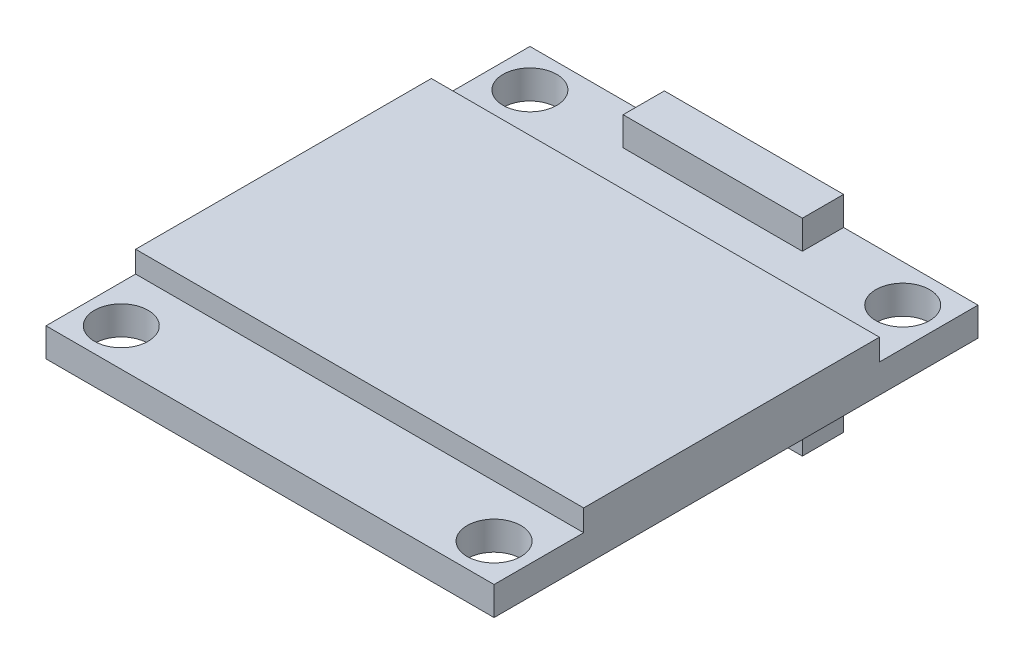
ISO-10303-21;
HEADER;
FILE_DESCRIPTION(('STEP AP214'),'2;1');
FILE_NAME('part.step','',(''),(''),'','','');
FILE_SCHEMA(('AUTOMOTIVE_DESIGN { 1 0 10303 214 1 1 1 1 }'));
ENDSEC;
DATA;
#1=APPLICATION_CONTEXT('core data for automotive mechanical design processes');
#2=APPLICATION_PROTOCOL_DEFINITION('international standard','automotive_design',2000,#1);
#3=PRODUCT_CONTEXT('',#1,'mechanical');
#4=PRODUCT('Part','Part','',(#3));
#5=PRODUCT_RELATED_PRODUCT_CATEGORY('part','',(#4));
#6=PRODUCT_DEFINITION_FORMATION('','',#4);
#7=PRODUCT_DEFINITION_CONTEXT('part definition',#1,'design');
#8=PRODUCT_DEFINITION('design','',#6,#7);
#9=PRODUCT_DEFINITION_SHAPE('','',#8);
#10=(LENGTH_UNIT() NAMED_UNIT(*) SI_UNIT(.MILLI.,.METRE.));
#11=(NAMED_UNIT(*) PLANE_ANGLE_UNIT() SI_UNIT($,.RADIAN.));
#12=(NAMED_UNIT(*) SI_UNIT($,.STERADIAN.) SOLID_ANGLE_UNIT());
#13=UNCERTAINTY_MEASURE_WITH_UNIT(LENGTH_MEASURE(1.E-05),#10,'distance_accuracy_value','');
#14=(GEOMETRIC_REPRESENTATION_CONTEXT(3) GLOBAL_UNCERTAINTY_ASSIGNED_CONTEXT((#13)) GLOBAL_UNIT_ASSIGNED_CONTEXT((#10,
#11,#12)) REPRESENTATION_CONTEXT('',''));
#15=CARTESIAN_POINT('',(0.,0.,0.));
#16=DIRECTION('',(0.,0.,1.));
#17=DIRECTION('',(1.,0.,0.));
#18=AXIS2_PLACEMENT_3D('',#15,#16,#17);
#19=CARTESIAN_POINT('',(0.,1.6,0.));
#20=DIRECTION('',(0.,-1.,0.));
#21=DIRECTION('',(0.,0.,-1.));
#22=AXIS2_PLACEMENT_3D('',#19,#20,#21);
#23=PLANE('',#22);
#24=CARTESIAN_POINT('',(22.9,1.6,-24.9));
#25=DIRECTION('',(0.,1.,0.));
#26=DIRECTION('',(0.,0.,-1.));
#27=AXIS2_PLACEMENT_3D('',#24,#25,#26);
#28=CIRCLE('',#27,1.5);
#29=CARTESIAN_POINT('',(22.9,1.6,-26.4));
#30=VERTEX_POINT('',#29);
#31=EDGE_CURVE('E230',#30,#30,#28,.T.);
#32=ORIENTED_EDGE('',*,*,#31,.F.);
#33=EDGE_LOOP('',(#32));
#34=FACE_BOUND('',#33,.T.);
#35=CARTESIAN_POINT('',(2.1,1.6,-24.9));
#36=DIRECTION('',(0.,1.,0.));
#37=DIRECTION('',(0.,0.,1.));
#38=AXIS2_PLACEMENT_3D('',#35,#36,#37);
#39=CIRCLE('',#38,1.5);
#40=CARTESIAN_POINT('',(2.1,1.6,-23.4));
#41=VERTEX_POINT('',#40);
#42=EDGE_CURVE('E229',#41,#41,#39,.T.);
#43=ORIENTED_EDGE('',*,*,#42,.F.);
#44=EDGE_LOOP('',(#43));
#45=FACE_BOUND('',#44,.T.);
#46=DIRECTION('',(-1.,0.,0.));
#47=VECTOR('',#46,1.);
#48=CARTESIAN_POINT('',(0.,1.6,-27.));
#49=LINE('',#48,#47);
#50=CARTESIAN_POINT('',(25.,1.6,-27.));
#51=VERTEX_POINT('',#50);
#52=CARTESIAN_POINT('',(17.5,1.6,-27.));
#53=VERTEX_POINT('',#52);
#54=EDGE_CURVE('E306',#51,#53,#49,.T.);
#55=ORIENTED_EDGE('',*,*,#54,.T.);
#56=DIRECTION('',(0.,0.,1.));
#57=VECTOR('',#56,1.);
#58=CARTESIAN_POINT('',(17.5,1.6,0.));
#59=LINE('',#58,#57);
#60=CARTESIAN_POINT('',(17.5,1.6,-24.7));
#61=VERTEX_POINT('',#60);
#62=EDGE_CURVE('E217',#53,#61,#59,.T.);
#63=ORIENTED_EDGE('',*,*,#62,.T.);
#64=DIRECTION('',(-1.,0.,0.));
#65=VECTOR('',#64,1.);
#66=CARTESIAN_POINT('',(0.,1.6,-24.7));
#67=LINE('',#66,#65);
#68=CARTESIAN_POINT('',(7.5,1.6,-24.7));
#69=VERTEX_POINT('',#68);
#70=EDGE_CURVE('E221',#61,#69,#67,.T.);
#71=ORIENTED_EDGE('',*,*,#70,.T.);
#72=DIRECTION('',(0.,0.,-1.));
#73=VECTOR('',#72,1.);
#74=CARTESIAN_POINT('',(7.5,1.6,0.));
#75=LINE('',#74,#73);
#76=CARTESIAN_POINT('',(7.5,1.6,-27.));
#77=VERTEX_POINT('',#76);
#78=EDGE_CURVE('E156',#69,#77,#75,.T.);
#79=ORIENTED_EDGE('',*,*,#78,.T.);
#80=CARTESIAN_POINT('',(0.,1.6,-27.));
#81=VERTEX_POINT('',#80);
#82=EDGE_CURVE('E305',#77,#81,#49,.T.);
#83=ORIENTED_EDGE('',*,*,#82,.T.);
#84=DIRECTION('',(0.,0.,1.));
#85=VECTOR('',#84,1.);
#86=CARTESIAN_POINT('',(0.,1.6,0.));
#87=LINE('',#86,#85);
#88=CARTESIAN_POINT('',(0.,1.6,-21.5));
#89=VERTEX_POINT('',#88);
#90=EDGE_CURVE('E294',#81,#89,#87,.T.);
#91=ORIENTED_EDGE('',*,*,#90,.T.);
#92=DIRECTION('',(-1.,0.,0.));
#93=VECTOR('',#92,1.);
#94=CARTESIAN_POINT('',(0.,1.6,-21.5));
#95=LINE('',#94,#93);
#96=CARTESIAN_POINT('',(25.,1.6,-21.5));
#97=VERTEX_POINT('',#96);
#98=EDGE_CURVE('E262',#97,#89,#95,.T.);
#99=ORIENTED_EDGE('',*,*,#98,.F.);
#100=DIRECTION('',(0.,0.,-1.));
#101=VECTOR('',#100,1.);
#102=CARTESIAN_POINT('',(25.,1.6,0.));
#103=LINE('',#102,#101);
#104=EDGE_CURVE('E301',#97,#51,#103,.T.);
#105=ORIENTED_EDGE('',*,*,#104,.T.);
#106=EDGE_LOOP('',(#55,#63,#71,#79,#83,#91,#99,#105));
#107=FACE_BOUND('',#106,.T.);
#108=ADVANCED_FACE('F41',(#34,#45,#107),#23,.F.);
#109=CARTESIAN_POINT('',(2.1,1.6,-2.1));
#110=DIRECTION('',(0.,1.,0.));
#111=DIRECTION('',(0.,0.,-1.));
#112=AXIS2_PLACEMENT_3D('',#109,#110,#111);
#113=CIRCLE('',#112,1.5);
#114=CARTESIAN_POINT('',(2.1,1.6,-3.6));
#115=VERTEX_POINT('',#114);
#116=EDGE_CURVE('E224',#115,#115,#113,.T.);
#117=ORIENTED_EDGE('',*,*,#116,.F.);
#118=EDGE_LOOP('',(#117));
#119=FACE_BOUND('',#118,.T.);
#120=CARTESIAN_POINT('',(22.9,1.6,-2.1));
#121=DIRECTION('',(0.,1.,0.));
#122=DIRECTION('',(0.,0.,1.));
#123=AXIS2_PLACEMENT_3D('',#120,#121,#122);
#124=CIRCLE('',#123,1.5);
#125=CARTESIAN_POINT('',(22.9,1.6,-0.599999999999997));
#126=VERTEX_POINT('',#125);
#127=EDGE_CURVE('E238',#126,#126,#124,.T.);
#128=ORIENTED_EDGE('',*,*,#127,.F.);
#129=EDGE_LOOP('',(#128));
#130=FACE_BOUND('',#129,.T.);
#131=DIRECTION('',(1.,0.,0.));
#132=VECTOR('',#131,1.);
#133=CARTESIAN_POINT('',(0.,1.6,-5.));
#134=LINE('',#133,#132);
#135=CARTESIAN_POINT('',(0.,1.6,-5.));
#136=VERTEX_POINT('',#135);
#137=CARTESIAN_POINT('',(25.,1.6,-5.));
#138=VERTEX_POINT('',#137);
#139=EDGE_CURVE('E253',#136,#138,#134,.T.);
#140=ORIENTED_EDGE('',*,*,#139,.F.);
#141=CARTESIAN_POINT('',(0.,1.6,0.));
#142=VERTEX_POINT('',#141);
#143=EDGE_CURVE('E298',#136,#142,#87,.T.);
#144=ORIENTED_EDGE('',*,*,#143,.T.);
#145=DIRECTION('',(1.,0.,0.));
#146=VECTOR('',#145,1.);
#147=CARTESIAN_POINT('',(0.,1.6,0.));
#148=LINE('',#147,#146);
#149=CARTESIAN_POINT('',(25.,1.6,0.));
#150=VERTEX_POINT('',#149);
#151=EDGE_CURVE('E297',#142,#150,#148,.T.);
#152=ORIENTED_EDGE('',*,*,#151,.T.);
#153=EDGE_CURVE('E302',#150,#138,#103,.T.);
#154=ORIENTED_EDGE('',*,*,#153,.T.);
#155=EDGE_LOOP('',(#140,#144,#152,#154));
#156=FACE_BOUND('',#155,.T.);
#157=ADVANCED_FACE('F392',(#119,#130,#156),#23,.F.);
#158=CARTESIAN_POINT('',(0.,1.6,0.));
#159=DIRECTION('',(1.,0.,0.));
#160=DIRECTION('',(0.,0.,-1.));
#161=AXIS2_PLACEMENT_3D('',#158,#159,#160);
#162=PLANE('',#161);
#163=DIRECTION('',(0.,0.,1.));
#164=VECTOR('',#163,1.);
#165=CARTESIAN_POINT('',(0.,0.,0.));
#166=LINE('',#165,#164);
#167=CARTESIAN_POINT('',(0.,0.,-27.));
#168=VERTEX_POINT('',#167);
#169=CARTESIAN_POINT('',(0.,0.,0.));
#170=VERTEX_POINT('',#169);
#171=EDGE_CURVE('E293',#168,#170,#166,.T.);
#172=ORIENTED_EDGE('',*,*,#171,.T.);
#173=DIRECTION('',(0.,-1.,0.));
#174=VECTOR('',#173,1.);
#175=CARTESIAN_POINT('',(0.,1.6,0.));
#176=LINE('',#175,#174);
#177=EDGE_CURVE('E336',#142,#170,#176,.T.);
#178=ORIENTED_EDGE('',*,*,#177,.F.);
#179=ORIENTED_EDGE('',*,*,#143,.F.);
#180=DIRECTION('',(0.,-1.,0.));
#181=VECTOR('',#180,1.);
#182=CARTESIAN_POINT('',(0.,2.8,-5.));
#183=LINE('',#182,#181);
#184=CARTESIAN_POINT('',(0.,2.8,-5.));
#185=VERTEX_POINT('',#184);
#186=EDGE_CURVE('E289',#185,#136,#183,.T.);
#187=ORIENTED_EDGE('',*,*,#186,.F.);
#188=DIRECTION('',(0.,0.,1.));
#189=VECTOR('',#188,1.);
#190=CARTESIAN_POINT('',(0.,2.8,-21.5));
#191=LINE('',#190,#189);
#192=CARTESIAN_POINT('',(0.,2.8,-21.5));
#193=VERTEX_POINT('',#192);
#194=EDGE_CURVE('E257',#193,#185,#191,.T.);
#195=ORIENTED_EDGE('',*,*,#194,.F.);
#196=DIRECTION('',(0.,-1.,0.));
#197=VECTOR('',#196,1.);
#198=CARTESIAN_POINT('',(0.,2.8,-21.5));
#199=LINE('',#198,#197);
#200=EDGE_CURVE('E271',#193,#89,#199,.T.);
#201=ORIENTED_EDGE('',*,*,#200,.T.);
#202=ORIENTED_EDGE('',*,*,#90,.F.);
#203=DIRECTION('',(0.,-1.,0.));
#204=VECTOR('',#203,1.);
#205=CARTESIAN_POINT('',(0.,1.6,-27.));
#206=LINE('',#205,#204);
#207=EDGE_CURVE('E310',#81,#168,#206,.T.);
#208=ORIENTED_EDGE('',*,*,#207,.T.);
#209=EDGE_LOOP('',(#172,#178,#179,#187,#195,#201,#202,#208));
#210=FACE_BOUND('',#209,.T.);
#211=ADVANCED_FACE('F43',(#210),#162,.F.);
#212=CARTESIAN_POINT('',(0.,1.6,0.));
#213=DIRECTION('',(0.,0.,-1.));
#214=DIRECTION('',(-1.,0.,0.));
#215=AXIS2_PLACEMENT_3D('',#212,#213,#214);
#216=PLANE('',#215);
#217=DIRECTION('',(1.,0.,0.));
#218=VECTOR('',#217,1.);
#219=CARTESIAN_POINT('',(0.,0.,0.));
#220=LINE('',#219,#218);
#221=CARTESIAN_POINT('',(25.,0.,0.));
#222=VERTEX_POINT('',#221);
#223=EDGE_CURVE('E314',#170,#222,#220,.T.);
#224=ORIENTED_EDGE('',*,*,#223,.T.);
#225=DIRECTION('',(0.,-1.,0.));
#226=VECTOR('',#225,1.);
#227=CARTESIAN_POINT('',(25.,1.6,0.));
#228=LINE('',#227,#226);
#229=EDGE_CURVE('E332',#150,#222,#228,.T.);
#230=ORIENTED_EDGE('',*,*,#229,.F.);
#231=ORIENTED_EDGE('',*,*,#151,.F.);
#232=ORIENTED_EDGE('',*,*,#177,.T.);
#233=EDGE_LOOP('',(#224,#230,#231,#232));
#234=FACE_BOUND('',#233,.T.);
#235=ADVANCED_FACE('F376',(#234),#216,.F.);
#236=CARTESIAN_POINT('',(25.,1.6,0.));
#237=DIRECTION('',(-1.,0.,0.));
#238=DIRECTION('',(0.,0.,1.));
#239=AXIS2_PLACEMENT_3D('',#236,#237,#238);
#240=PLANE('',#239);
#241=DIRECTION('',(0.,0.,-1.));
#242=VECTOR('',#241,1.);
#243=CARTESIAN_POINT('',(25.,0.,0.));
#244=LINE('',#243,#242);
#245=CARTESIAN_POINT('',(25.,0.,-27.));
#246=VERTEX_POINT('',#245);
#247=EDGE_CURVE('E317',#222,#246,#244,.T.);
#248=ORIENTED_EDGE('',*,*,#247,.T.);
#249=DIRECTION('',(0.,-1.,0.));
#250=VECTOR('',#249,1.);
#251=CARTESIAN_POINT('',(25.,1.6,-27.));
#252=LINE('',#251,#250);
#253=EDGE_CURVE('E328',#51,#246,#252,.T.);
#254=ORIENTED_EDGE('',*,*,#253,.F.);
#255=ORIENTED_EDGE('',*,*,#104,.F.);
#256=DIRECTION('',(0.,-1.,0.));
#257=VECTOR('',#256,1.);
#258=CARTESIAN_POINT('',(25.,2.8,-21.5));
#259=LINE('',#258,#257);
#260=CARTESIAN_POINT('',(25.,2.8,-21.5));
#261=VERTEX_POINT('',#260);
#262=EDGE_CURVE('E281',#261,#97,#259,.T.);
#263=ORIENTED_EDGE('',*,*,#262,.F.);
#264=DIRECTION('',(0.,0.,-1.));
#265=VECTOR('',#264,1.);
#266=CARTESIAN_POINT('',(25.,2.8,-21.5));
#267=LINE('',#266,#265);
#268=CARTESIAN_POINT('',(25.,2.8,-5.));
#269=VERTEX_POINT('',#268);
#270=EDGE_CURVE('E265',#269,#261,#267,.T.);
#271=ORIENTED_EDGE('',*,*,#270,.F.);
#272=DIRECTION('',(0.,-1.,0.));
#273=VECTOR('',#272,1.);
#274=CARTESIAN_POINT('',(25.,2.8,-5.));
#275=LINE('',#274,#273);
#276=EDGE_CURVE('E285',#269,#138,#275,.T.);
#277=ORIENTED_EDGE('',*,*,#276,.T.);
#278=ORIENTED_EDGE('',*,*,#153,.F.);
#279=ORIENTED_EDGE('',*,*,#229,.T.);
#280=EDGE_LOOP('',(#248,#254,#255,#263,#271,#277,#278,#279));
#281=FACE_BOUND('',#280,.T.);
#282=ADVANCED_FACE('F368',(#281),#240,.F.);
#283=CARTESIAN_POINT('',(0.,1.6,-27.));
#284=DIRECTION('',(0.,0.,1.));
#285=DIRECTION('',(1.,0.,0.));
#286=AXIS2_PLACEMENT_3D('',#283,#284,#285);
#287=PLANE('',#286);
#288=ORIENTED_EDGE('',*,*,#82,.F.);
#289=DIRECTION('',(0.,1.,0.));
#290=VECTOR('',#289,1.);
#291=CARTESIAN_POINT('',(7.5,-26.8610915598683,-27.));
#292=LINE('',#291,#290);
#293=CARTESIAN_POINT('',(7.5,3.2,-27.));
#294=VERTEX_POINT('',#293);
#295=EDGE_CURVE('E57',#77,#294,#292,.T.);
#296=ORIENTED_EDGE('',*,*,#295,.T.);
#297=DIRECTION('',(-1.,0.,0.));
#298=VECTOR('',#297,1.);
#299=CARTESIAN_POINT('',(7.5,3.2,-27.));
#300=LINE('',#299,#298);
#301=CARTESIAN_POINT('',(17.5,3.2,-27.));
#302=VERTEX_POINT('',#301);
#303=EDGE_CURVE('E177',#302,#294,#300,.T.);
#304=ORIENTED_EDGE('',*,*,#303,.F.);
#305=DIRECTION('',(0.,1.,0.));
#306=VECTOR('',#305,1.);
#307=CARTESIAN_POINT('',(17.5,-26.8610915598683,-27.));
#308=LINE('',#307,#306);
#309=EDGE_CURVE('E202',#53,#302,#308,.T.);
#310=ORIENTED_EDGE('',*,*,#309,.F.);
#311=ORIENTED_EDGE('',*,*,#54,.F.);
#312=ORIENTED_EDGE('',*,*,#253,.T.);
#313=DIRECTION('',(-1.,0.,0.));
#314=VECTOR('',#313,1.);
#315=CARTESIAN_POINT('',(0.,0.,-27.));
#316=LINE('',#315,#314);
#317=CARTESIAN_POINT('',(17.5,0.,-27.));
#318=VERTEX_POINT('',#317);
#319=EDGE_CURVE('E321',#246,#318,#316,.T.);
#320=ORIENTED_EDGE('',*,*,#319,.T.);
#321=CARTESIAN_POINT('',(17.5,-8.3,-27.));
#322=VERTEX_POINT('',#321);
#323=EDGE_CURVE('E197',#322,#318,#308,.T.);
#324=ORIENTED_EDGE('',*,*,#323,.F.);
#325=DIRECTION('',(-1.,0.,0.));
#326=VECTOR('',#325,1.);
#327=CARTESIAN_POINT('',(7.5,-8.3,-27.));
#328=LINE('',#327,#326);
#329=CARTESIAN_POINT('',(7.5,-8.3,-27.));
#330=VERTEX_POINT('',#329);
#331=EDGE_CURVE('E193',#322,#330,#328,.T.);
#332=ORIENTED_EDGE('',*,*,#331,.T.);
#333=CARTESIAN_POINT('',(7.5,0.,-27.));
#334=VERTEX_POINT('',#333);
#335=EDGE_CURVE('E192',#330,#334,#292,.T.);
#336=ORIENTED_EDGE('',*,*,#335,.T.);
#337=EDGE_CURVE('E320',#334,#168,#316,.T.);
#338=ORIENTED_EDGE('',*,*,#337,.T.);
#339=ORIENTED_EDGE('',*,*,#207,.F.);
#340=EDGE_LOOP('',(#288,#296,#304,#310,#311,#312,#320,#324,#332,#336,#338,#339));
#341=FACE_BOUND('',#340,.T.);
#342=ADVANCED_FACE('F362',(#341),#287,.F.);
#343=CARTESIAN_POINT('',(0.,0.,0.));
#344=DIRECTION('',(0.,-1.,0.));
#345=DIRECTION('',(0.,0.,-1.));
#346=AXIS2_PLACEMENT_3D('',#343,#344,#345);
#347=PLANE('',#346);
#348=DIRECTION('',(0.,0.,1.));
#349=VECTOR('',#348,1.);
#350=CARTESIAN_POINT('',(17.5,0.,0.));
#351=LINE('',#350,#349);
#352=CARTESIAN_POINT('',(17.5,0.,-24.7));
#353=VERTEX_POINT('',#352);
#354=EDGE_CURVE('E12',#318,#353,#351,.T.);
#355=ORIENTED_EDGE('',*,*,#354,.F.);
#356=ORIENTED_EDGE('',*,*,#319,.F.);
#357=ORIENTED_EDGE('',*,*,#247,.F.);
#358=ORIENTED_EDGE('',*,*,#223,.F.);
#359=ORIENTED_EDGE('',*,*,#171,.F.);
#360=ORIENTED_EDGE('',*,*,#337,.F.);
#361=DIRECTION('',(0.,0.,-1.));
#362=VECTOR('',#361,1.);
#363=CARTESIAN_POINT('',(7.5,0.,0.));
#364=LINE('',#363,#362);
#365=CARTESIAN_POINT('',(7.5,0.,-24.7));
#366=VERTEX_POINT('',#365);
#367=EDGE_CURVE('E340',#366,#334,#364,.T.);
#368=ORIENTED_EDGE('',*,*,#367,.F.);
#369=DIRECTION('',(-1.,0.,0.));
#370=VECTOR('',#369,1.);
#371=CARTESIAN_POINT('',(0.,0.,-24.7));
#372=LINE('',#371,#370);
#373=EDGE_CURVE('E50',#353,#366,#372,.T.);
#374=ORIENTED_EDGE('',*,*,#373,.F.);
#375=EDGE_LOOP('',(#355,#356,#357,#358,#359,#360,#368,#374));
#376=FACE_BOUND('',#375,.T.);
#377=CARTESIAN_POINT('',(2.1,0.,-2.1));
#378=DIRECTION('',(0.,1.,0.));
#379=DIRECTION('',(0.,0.,-1.));
#380=AXIS2_PLACEMENT_3D('',#377,#378,#379);
#381=CIRCLE('',#380,1.5);
#382=CARTESIAN_POINT('',(2.1,0.,-3.6));
#383=VERTEX_POINT('',#382);
#384=EDGE_CURVE('E242',#383,#383,#381,.T.);
#385=ORIENTED_EDGE('',*,*,#384,.T.);
#386=EDGE_LOOP('',(#385));
#387=FACE_BOUND('',#386,.T.);
#388=CARTESIAN_POINT('',(22.9,0.,-2.1));
#389=DIRECTION('',(0.,1.,0.));
#390=DIRECTION('',(0.,0.,1.));
#391=AXIS2_PLACEMENT_3D('',#388,#389,#390);
#392=CIRCLE('',#391,1.5);
#393=CARTESIAN_POINT('',(22.9,0.,-0.599999999999997));
#394=VERTEX_POINT('',#393);
#395=EDGE_CURVE('E234',#394,#394,#392,.T.);
#396=ORIENTED_EDGE('',*,*,#395,.T.);
#397=EDGE_LOOP('',(#396));
#398=FACE_BOUND('',#397,.T.);
#399=CARTESIAN_POINT('',(22.9,0.,-24.9));
#400=DIRECTION('',(0.,1.,0.));
#401=DIRECTION('',(0.,0.,-1.));
#402=AXIS2_PLACEMENT_3D('',#399,#400,#401);
#403=CIRCLE('',#402,1.5);
#404=CARTESIAN_POINT('',(22.9,0.,-26.4));
#405=VERTEX_POINT('',#404);
#406=EDGE_CURVE('E225',#405,#405,#403,.T.);
#407=ORIENTED_EDGE('',*,*,#406,.T.);
#408=EDGE_LOOP('',(#407));
#409=FACE_BOUND('',#408,.T.);
#410=CARTESIAN_POINT('',(2.1,0.,-24.9));
#411=DIRECTION('',(0.,1.,0.));
#412=DIRECTION('',(0.,0.,1.));
#413=AXIS2_PLACEMENT_3D('',#410,#411,#412);
#414=CIRCLE('',#413,1.5);
#415=CARTESIAN_POINT('',(2.1,0.,-23.4));
#416=VERTEX_POINT('',#415);
#417=EDGE_CURVE('E249',#416,#416,#414,.T.);
#418=ORIENTED_EDGE('',*,*,#417,.T.);
#419=EDGE_LOOP('',(#418));
#420=FACE_BOUND('',#419,.T.);
#421=ADVANCED_FACE('F357',(#376,#387,#398,#409,#420),#347,.T.);
#422=CARTESIAN_POINT('',(0.,2.8,-5.));
#423=DIRECTION('',(0.,0.,-1.));
#424=DIRECTION('',(-1.,0.,0.));
#425=AXIS2_PLACEMENT_3D('',#422,#423,#424);
#426=PLANE('',#425);
#427=ORIENTED_EDGE('',*,*,#139,.T.);
#428=ORIENTED_EDGE('',*,*,#276,.F.);
#429=DIRECTION('',(1.,0.,0.));
#430=VECTOR('',#429,1.);
#431=CARTESIAN_POINT('',(0.,2.8,-5.));
#432=LINE('',#431,#430);
#433=EDGE_CURVE('E261',#185,#269,#432,.T.);
#434=ORIENTED_EDGE('',*,*,#433,.F.);
#435=ORIENTED_EDGE('',*,*,#186,.T.);
#436=EDGE_LOOP('',(#427,#428,#434,#435));
#437=FACE_BOUND('',#436,.T.);
#438=ADVANCED_FACE('F396',(#437),#426,.F.);
#439=CARTESIAN_POINT('',(0.,2.8,-21.5));
#440=DIRECTION('',(0.,0.,1.));
#441=DIRECTION('',(1.,0.,0.));
#442=AXIS2_PLACEMENT_3D('',#439,#440,#441);
#443=PLANE('',#442);
#444=ORIENTED_EDGE('',*,*,#98,.T.);
#445=ORIENTED_EDGE('',*,*,#200,.F.);
#446=DIRECTION('',(-1.,0.,0.));
#447=VECTOR('',#446,1.);
#448=CARTESIAN_POINT('',(0.,2.8,-21.5));
#449=LINE('',#448,#447);
#450=EDGE_CURVE('E268',#261,#193,#449,.T.);
#451=ORIENTED_EDGE('',*,*,#450,.F.);
#452=ORIENTED_EDGE('',*,*,#262,.T.);
#453=EDGE_LOOP('',(#444,#445,#451,#452));
#454=FACE_BOUND('',#453,.T.);
#455=ADVANCED_FACE('F404',(#454),#443,.F.);
#456=CARTESIAN_POINT('',(0.,2.8,0.));
#457=DIRECTION('',(0.,1.,0.));
#458=DIRECTION('',(0.,0.,1.));
#459=AXIS2_PLACEMENT_3D('',#456,#457,#458);
#460=PLANE('',#459);
#461=ORIENTED_EDGE('',*,*,#194,.T.);
#462=ORIENTED_EDGE('',*,*,#433,.T.);
#463=ORIENTED_EDGE('',*,*,#270,.T.);
#464=ORIENTED_EDGE('',*,*,#450,.T.);
#465=EDGE_LOOP('',(#461,#462,#463,#464));
#466=FACE_BOUND('',#465,.T.);
#467=ADVANCED_FACE('F400',(#466),#460,.T.);
#468=CARTESIAN_POINT('',(2.1,0.,-24.9));
#469=DIRECTION('',(0.,1.,0.));
#470=DIRECTION('',(0.,0.,1.));
#471=AXIS2_PLACEMENT_3D('',#468,#469,#470);
#472=CYLINDRICAL_SURFACE('',#471,1.5);
#473=ORIENTED_EDGE('',*,*,#417,.F.);
#474=EDGE_LOOP('',(#473));
#475=FACE_BOUND('',#474,.T.);
#476=ORIENTED_EDGE('',*,*,#42,.T.);
#477=EDGE_LOOP('',(#476));
#478=FACE_BOUND('',#477,.T.);
#479=ADVANCED_FACE('F411',(#475,#478),#472,.F.);
#480=CARTESIAN_POINT('',(22.9,0.,-24.9));
#481=DIRECTION('',(0.,1.,0.));
#482=DIRECTION('',(0.,0.,1.));
#483=AXIS2_PLACEMENT_3D('',#480,#481,#482);
#484=CYLINDRICAL_SURFACE('',#483,1.5);
#485=ORIENTED_EDGE('',*,*,#406,.F.);
#486=EDGE_LOOP('',(#485));
#487=FACE_BOUND('',#486,.T.);
#488=ORIENTED_EDGE('',*,*,#31,.T.);
#489=EDGE_LOOP('',(#488));
#490=FACE_BOUND('',#489,.T.);
#491=ADVANCED_FACE('F454',(#487,#490),#484,.F.);
#492=CARTESIAN_POINT('',(22.9,0.,-2.1));
#493=DIRECTION('',(0.,1.,0.));
#494=DIRECTION('',(0.,0.,1.));
#495=AXIS2_PLACEMENT_3D('',#492,#493,#494);
#496=CYLINDRICAL_SURFACE('',#495,1.5);
#497=ORIENTED_EDGE('',*,*,#395,.F.);
#498=EDGE_LOOP('',(#497));
#499=FACE_BOUND('',#498,.T.);
#500=ORIENTED_EDGE('',*,*,#127,.T.);
#501=EDGE_LOOP('',(#500));
#502=FACE_BOUND('',#501,.T.);
#503=ADVANCED_FACE('F464',(#499,#502),#496,.F.);
#504=CARTESIAN_POINT('',(2.1,0.,-2.1));
#505=DIRECTION('',(0.,1.,0.));
#506=DIRECTION('',(0.,0.,1.));
#507=AXIS2_PLACEMENT_3D('',#504,#505,#506);
#508=CYLINDRICAL_SURFACE('',#507,1.5);
#509=ORIENTED_EDGE('',*,*,#384,.F.);
#510=EDGE_LOOP('',(#509));
#511=FACE_BOUND('',#510,.T.);
#512=ORIENTED_EDGE('',*,*,#116,.T.);
#513=EDGE_LOOP('',(#512));
#514=FACE_BOUND('',#513,.T.);
#515=ADVANCED_FACE('F474',(#511,#514),#508,.F.);
#516=CARTESIAN_POINT('',(0.,-8.3,0.));
#517=DIRECTION('',(0.,-1.,0.));
#518=DIRECTION('',(0.,0.,-1.));
#519=AXIS2_PLACEMENT_3D('',#516,#517,#518);
#520=PLANE('',#519);
#521=DIRECTION('',(0.,0.,1.));
#522=VECTOR('',#521,1.);
#523=CARTESIAN_POINT('',(7.5,-8.3,-27.));
#524=LINE('',#523,#522);
#525=CARTESIAN_POINT('',(7.5,-8.3,-24.7));
#526=VERTEX_POINT('',#525);
#527=EDGE_CURVE('E161',#330,#526,#524,.T.);
#528=ORIENTED_EDGE('',*,*,#527,.F.);
#529=ORIENTED_EDGE('',*,*,#331,.F.);
#530=DIRECTION('',(0.,0.,-1.));
#531=VECTOR('',#530,1.);
#532=CARTESIAN_POINT('',(17.5,-8.3,-27.));
#533=LINE('',#532,#531);
#534=CARTESIAN_POINT('',(17.5,-8.3,-24.7));
#535=VERTEX_POINT('',#534);
#536=EDGE_CURVE('E198',#535,#322,#533,.T.);
#537=ORIENTED_EDGE('',*,*,#536,.F.);
#538=DIRECTION('',(1.,0.,0.));
#539=VECTOR('',#538,1.);
#540=CARTESIAN_POINT('',(7.5,-8.3,-24.7));
#541=LINE('',#540,#539);
#542=EDGE_CURVE('E185',#526,#535,#541,.T.);
#543=ORIENTED_EDGE('',*,*,#542,.F.);
#544=EDGE_LOOP('',(#528,#529,#537,#543));
#545=FACE_BOUND('',#544,.T.);
#546=ADVANCED_FACE('F352',(#545),#520,.T.);
#547=CARTESIAN_POINT('',(7.5,-26.8610915598683,-27.));
#548=DIRECTION('',(-1.,0.,0.));
#549=DIRECTION('',(0.,0.,1.));
#550=AXIS2_PLACEMENT_3D('',#547,#548,#549);
#551=PLANE('',#550);
#552=DIRECTION('',(0.,1.,0.));
#553=VECTOR('',#552,1.);
#554=CARTESIAN_POINT('',(7.5,-26.8610915598683,-24.7));
#555=LINE('',#554,#553);
#556=EDGE_CURVE('E160',#526,#366,#555,.T.);
#557=ORIENTED_EDGE('',*,*,#556,.T.);
#558=ORIENTED_EDGE('',*,*,#367,.T.);
#559=ORIENTED_EDGE('',*,*,#335,.F.);
#560=ORIENTED_EDGE('',*,*,#527,.T.);
#561=EDGE_LOOP('',(#557,#558,#559,#560));
#562=FACE_BOUND('',#561,.T.);
#563=ADVANCED_FACE('F349',(#562),#551,.T.);
#564=CARTESIAN_POINT('',(17.5,-26.8610915598683,-27.));
#565=DIRECTION('',(1.,0.,0.));
#566=DIRECTION('',(0.,0.,-1.));
#567=AXIS2_PLACEMENT_3D('',#564,#565,#566);
#568=PLANE('',#567);
#569=ORIENTED_EDGE('',*,*,#323,.T.);
#570=ORIENTED_EDGE('',*,*,#354,.T.);
#571=DIRECTION('',(0.,1.,0.));
#572=VECTOR('',#571,1.);
#573=CARTESIAN_POINT('',(17.5,-26.8610915598683,-24.7));
#574=LINE('',#573,#572);
#575=EDGE_CURVE('E203',#535,#353,#574,.T.);
#576=ORIENTED_EDGE('',*,*,#575,.F.);
#577=ORIENTED_EDGE('',*,*,#536,.T.);
#578=EDGE_LOOP('',(#569,#570,#576,#577));
#579=FACE_BOUND('',#578,.T.);
#580=ADVANCED_FACE('F355',(#579),#568,.T.);
#581=CARTESIAN_POINT('',(7.5,-26.8610915598683,-24.7));
#582=DIRECTION('',(0.,0.,1.));
#583=DIRECTION('',(1.,0.,0.));
#584=AXIS2_PLACEMENT_3D('',#581,#582,#583);
#585=PLANE('',#584);
#586=ORIENTED_EDGE('',*,*,#575,.T.);
#587=ORIENTED_EDGE('',*,*,#373,.T.);
#588=ORIENTED_EDGE('',*,*,#556,.F.);
#589=ORIENTED_EDGE('',*,*,#542,.T.);
#590=EDGE_LOOP('',(#586,#587,#588,#589));
#591=FACE_BOUND('',#590,.T.);
#592=ADVANCED_FACE('F346',(#591),#585,.T.);
#593=ORIENTED_EDGE('',*,*,#70,.F.);
#594=CARTESIAN_POINT('',(17.5,3.2,-24.7));
#595=VERTEX_POINT('',#594);
#596=EDGE_CURVE('E167',#61,#595,#574,.T.);
#597=ORIENTED_EDGE('',*,*,#596,.T.);
#598=DIRECTION('',(1.,0.,0.));
#599=VECTOR('',#598,1.);
#600=CARTESIAN_POINT('',(7.5,3.2,-24.7));
#601=LINE('',#600,#599);
#602=CARTESIAN_POINT('',(7.5,3.2,-24.7));
#603=VERTEX_POINT('',#602);
#604=EDGE_CURVE('E164',#603,#595,#601,.T.);
#605=ORIENTED_EDGE('',*,*,#604,.F.);
#606=EDGE_CURVE('E151',#69,#603,#555,.T.);
#607=ORIENTED_EDGE('',*,*,#606,.F.);
#608=EDGE_LOOP('',(#593,#597,#605,#607));
#609=FACE_BOUND('',#608,.T.);
#610=ADVANCED_FACE('F165',(#609),#585,.T.);
#611=ORIENTED_EDGE('',*,*,#62,.F.);
#612=ORIENTED_EDGE('',*,*,#309,.T.);
#613=DIRECTION('',(0.,0.,-1.));
#614=VECTOR('',#613,1.);
#615=CARTESIAN_POINT('',(17.5,3.2,-27.));
#616=LINE('',#615,#614);
#617=EDGE_CURVE('E172',#595,#302,#616,.T.);
#618=ORIENTED_EDGE('',*,*,#617,.F.);
#619=ORIENTED_EDGE('',*,*,#596,.F.);
#620=EDGE_LOOP('',(#611,#612,#618,#619));
#621=FACE_BOUND('',#620,.T.);
#622=ADVANCED_FACE('F387',(#621),#568,.T.);
#623=ORIENTED_EDGE('',*,*,#78,.F.);
#624=ORIENTED_EDGE('',*,*,#606,.T.);
#625=DIRECTION('',(0.,0.,1.));
#626=VECTOR('',#625,1.);
#627=CARTESIAN_POINT('',(7.5,3.2,-27.));
#628=LINE('',#627,#626);
#629=EDGE_CURVE('E155',#294,#603,#628,.T.);
#630=ORIENTED_EDGE('',*,*,#629,.F.);
#631=ORIENTED_EDGE('',*,*,#295,.F.);
#632=EDGE_LOOP('',(#623,#624,#630,#631));
#633=FACE_BOUND('',#632,.T.);
#634=ADVANCED_FACE('F153',(#633),#551,.T.);
#635=CARTESIAN_POINT('',(0.,3.2,0.));
#636=DIRECTION('',(0.,1.,0.));
#637=DIRECTION('',(0.,0.,1.));
#638=AXIS2_PLACEMENT_3D('',#635,#636,#637);
#639=PLANE('',#638);
#640=ORIENTED_EDGE('',*,*,#629,.T.);
#641=ORIENTED_EDGE('',*,*,#604,.T.);
#642=ORIENTED_EDGE('',*,*,#617,.T.);
#643=ORIENTED_EDGE('',*,*,#303,.T.);
#644=EDGE_LOOP('',(#640,#641,#642,#643));
#645=FACE_BOUND('',#644,.T.);
#646=ADVANCED_FACE('F175',(#645),#639,.T.);
#647=CLOSED_SHELL('',(#108,#157,#211,#235,#282,#342,#421,#438,#455,#467,#479,#491,#503,#515,
#546,#563,#580,#592,#610,#622,#634,#646));
#648=MANIFOLD_SOLID_BREP('B2',#647);
#649=ADVANCED_BREP_SHAPE_REPRESENTATION('',(#18,#648),#14);
#650=SHAPE_DEFINITION_REPRESENTATION(#9,#649);
ENDSEC;
END-ISO-10303-21;
